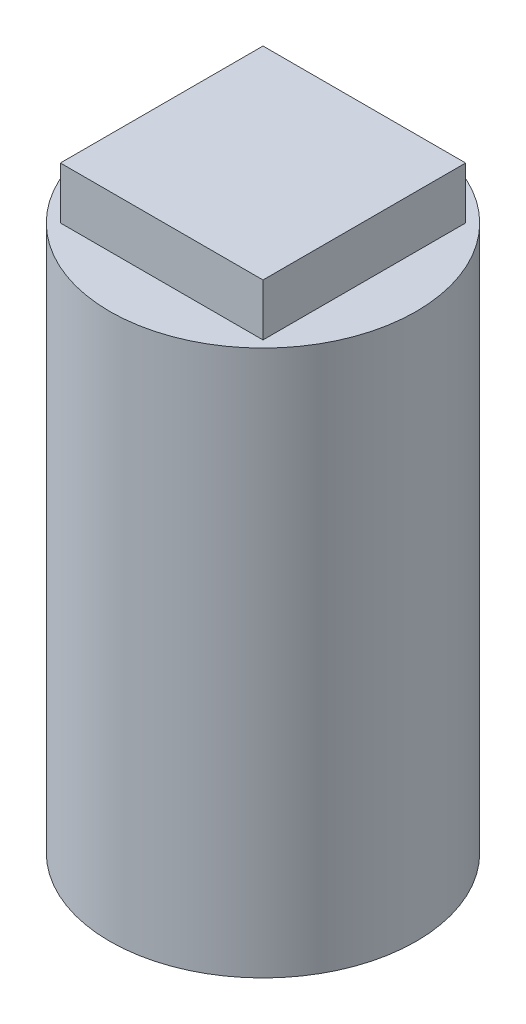
ISO-10303-21;
HEADER;
FILE_DESCRIPTION(('STEP AP214'),'2;1');
FILE_NAME('part.step','',(''),(''),'','','');
FILE_SCHEMA(('AUTOMOTIVE_DESIGN { 1 0 10303 214 1 1 1 1 }'));
ENDSEC;
DATA;
#1=APPLICATION_CONTEXT('core data for automotive mechanical design processes');
#2=APPLICATION_PROTOCOL_DEFINITION('international standard','automotive_design',2000,#1);
#3=PRODUCT_CONTEXT('',#1,'mechanical');
#4=PRODUCT('Part','Part','',(#3));
#5=PRODUCT_RELATED_PRODUCT_CATEGORY('part','',(#4));
#6=PRODUCT_DEFINITION_FORMATION('','',#4);
#7=PRODUCT_DEFINITION_CONTEXT('part definition',#1,'design');
#8=PRODUCT_DEFINITION('design','',#6,#7);
#9=PRODUCT_DEFINITION_SHAPE('','',#8);
#10=(LENGTH_UNIT() NAMED_UNIT(*) SI_UNIT(.MILLI.,.METRE.));
#11=(NAMED_UNIT(*) PLANE_ANGLE_UNIT() SI_UNIT($,.RADIAN.));
#12=(NAMED_UNIT(*) SI_UNIT($,.STERADIAN.) SOLID_ANGLE_UNIT());
#13=UNCERTAINTY_MEASURE_WITH_UNIT(LENGTH_MEASURE(1.E-05),#10,'distance_accuracy_value','');
#14=(GEOMETRIC_REPRESENTATION_CONTEXT(3) GLOBAL_UNCERTAINTY_ASSIGNED_CONTEXT((#13)) GLOBAL_UNIT_ASSIGNED_CONTEXT((#10,
#11,#12)) REPRESENTATION_CONTEXT('',''));
#15=CARTESIAN_POINT('',(0.,0.,0.));
#16=DIRECTION('',(0.,0.,1.));
#17=DIRECTION('',(1.,0.,0.));
#18=AXIS2_PLACEMENT_3D('',#15,#16,#17);
#19=CARTESIAN_POINT('',(0.,10.5,0.));
#20=DIRECTION('',(0.,-1.,0.));
#21=DIRECTION('',(0.,0.,-1.));
#22=AXIS2_PLACEMENT_3D('',#19,#20,#21);
#23=CYLINDRICAL_SURFACE('',#22,2.95);
#24=CARTESIAN_POINT('',(0.,10.5,0.));
#25=DIRECTION('',(0.,1.,0.));
#26=DIRECTION('',(0.,0.,1.));
#27=AXIS2_PLACEMENT_3D('',#24,#25,#26);
#28=CIRCLE('',#27,2.95);
#29=CARTESIAN_POINT('',(0.,10.5,-2.95));
#30=VERTEX_POINT('',#29);
#31=EDGE_CURVE('E11',#30,#30,#28,.T.);
#32=CARTESIAN_POINT('',(0.,0.,0.));
#33=DIRECTION('',(0.,1.,0.));
#34=DIRECTION('',(0.,0.,1.));
#35=AXIS2_PLACEMENT_3D('',#32,#33,#34);
#36=CIRCLE('',#35,2.95);
#37=CARTESIAN_POINT('',(0.,0.,-2.95));
#38=VERTEX_POINT('',#37);
#39=EDGE_CURVE('E42',#38,#38,#36,.T.);
#40=CARTESIAN_POINT('',(0.,10.5,-2.95));
#41=CARTESIAN_POINT('',(0.,10.390625,-2.95));
#42=CARTESIAN_POINT('',(0.,10.28125,-2.95));
#43=CARTESIAN_POINT('',(0.,10.0625,-2.95));
#44=CARTESIAN_POINT('',(0.,9.953125,-2.95));
#45=CARTESIAN_POINT('',(0.,9.734375,-2.95));
#46=CARTESIAN_POINT('',(0.,9.625,-2.95));
#47=CARTESIAN_POINT('',(0.,9.40625,-2.95));
#48=CARTESIAN_POINT('',(0.,9.296875,-2.95));
#49=CARTESIAN_POINT('',(0.,9.078125,-2.95));
#50=CARTESIAN_POINT('',(0.,8.96875,-2.95));
#51=CARTESIAN_POINT('',(0.,8.75,-2.95));
#52=CARTESIAN_POINT('',(0.,8.640625,-2.95));
#53=CARTESIAN_POINT('',(0.,8.421875,-2.95));
#54=CARTESIAN_POINT('',(0.,8.3125,-2.95));
#55=CARTESIAN_POINT('',(0.,8.09375,-2.95));
#56=CARTESIAN_POINT('',(0.,7.984375,-2.95));
#57=CARTESIAN_POINT('',(0.,7.765625,-2.95));
#58=CARTESIAN_POINT('',(0.,7.65625,-2.95));
#59=CARTESIAN_POINT('',(0.,7.4375,-2.95));
#60=CARTESIAN_POINT('',(0.,7.328125,-2.95));
#61=CARTESIAN_POINT('',(0.,7.109375,-2.95));
#62=CARTESIAN_POINT('',(0.,7.,-2.95));
#63=CARTESIAN_POINT('',(0.,6.78125,-2.95));
#64=CARTESIAN_POINT('',(0.,6.671875,-2.95));
#65=CARTESIAN_POINT('',(0.,6.453125,-2.95));
#66=CARTESIAN_POINT('',(0.,6.34375,-2.95));
#67=CARTESIAN_POINT('',(0.,6.125,-2.95));
#68=CARTESIAN_POINT('',(0.,6.015625,-2.95));
#69=CARTESIAN_POINT('',(0.,5.796875,-2.95));
#70=CARTESIAN_POINT('',(0.,5.6875,-2.95));
#71=CARTESIAN_POINT('',(0.,5.46875,-2.95));
#72=CARTESIAN_POINT('',(0.,5.359375,-2.95));
#73=CARTESIAN_POINT('',(0.,5.140625,-2.95));
#74=CARTESIAN_POINT('',(0.,5.03125,-2.95));
#75=CARTESIAN_POINT('',(0.,4.8125,-2.95));
#76=CARTESIAN_POINT('',(0.,4.703125,-2.95));
#77=CARTESIAN_POINT('',(0.,4.484375,-2.95));
#78=CARTESIAN_POINT('',(0.,4.375,-2.95));
#79=CARTESIAN_POINT('',(0.,4.15625,-2.95));
#80=CARTESIAN_POINT('',(0.,4.046875,-2.95));
#81=CARTESIAN_POINT('',(0.,3.828125,-2.95));
#82=CARTESIAN_POINT('',(0.,3.71875,-2.95));
#83=CARTESIAN_POINT('',(0.,3.5,-2.95));
#84=CARTESIAN_POINT('',(0.,3.390625,-2.95));
#85=CARTESIAN_POINT('',(0.,3.171875,-2.95));
#86=CARTESIAN_POINT('',(0.,3.0625,-2.95));
#87=CARTESIAN_POINT('',(0.,2.84375,-2.95));
#88=CARTESIAN_POINT('',(0.,2.734375,-2.95));
#89=CARTESIAN_POINT('',(0.,2.515625,-2.95));
#90=CARTESIAN_POINT('',(0.,2.40625,-2.95));
#91=CARTESIAN_POINT('',(0.,2.1875,-2.95));
#92=CARTESIAN_POINT('',(0.,2.078125,-2.95));
#93=CARTESIAN_POINT('',(0.,1.859375,-2.95));
#94=CARTESIAN_POINT('',(0.,1.75,-2.95));
#95=CARTESIAN_POINT('',(0.,1.53125,-2.95));
#96=CARTESIAN_POINT('',(0.,1.421875,-2.95));
#97=CARTESIAN_POINT('',(0.,1.203125,-2.95));
#98=CARTESIAN_POINT('',(0.,1.09375,-2.95));
#99=CARTESIAN_POINT('',(0.,0.875000000000001,-2.95));
#100=CARTESIAN_POINT('',(0.,0.765625000000001,-2.95));
#101=CARTESIAN_POINT('',(0.,0.546875,-2.95));
#102=CARTESIAN_POINT('',(0.,0.4375,-2.95));
#103=CARTESIAN_POINT('',(0.,0.21875,-2.95));
#104=CARTESIAN_POINT('',(0.,0.109375,-2.95));
#105=CARTESIAN_POINT('',(0.,0.,-2.95));
#106=B_SPLINE_CURVE_WITH_KNOTS('',3,(#40,#41,#42,#43,#44,#45,#46,#47,#48,#49,#50,#51,#52,#53,
#54,#55,#56,#57,#58,#59,#60,#61,#62,#63,#64,#65,#66,#67,#68,#69,#70,#71,#72,#73,#74,#75,#76,#77,
#78,#79,#80,#81,#82,#83,#84,#85,#86,#87,#88,#89,#90,#91,#92,#93,#94,#95,#96,#97,#98,#99,#100,
#101,#102,#103,#104,#105),.UNSPECIFIED.,.F.,.F.,(4,2,2,2,2,2,2,2,2,2,2,2,2,2,2,2,2,2,2,2,2,2,2,
2,2,2,2,2,2,2,2,2,4),(0.,0.328125,0.656250000000001,0.984375000000001,1.3125,1.640625,1.96875,
2.296875,2.625,2.953125,3.28125,3.609375,3.9375,4.265625,4.59375,4.921875,5.25,5.578125,5.90625,
6.234375,6.5625,6.890625,7.21875,7.546875,7.875,8.203125,8.53125,8.859375,9.1875,9.515625,
9.84375,10.171875,10.5),.UNSPECIFIED.);
#107=EDGE_CURVE('BSEAM39',#30,#38,#106,.T.);
#108=ORIENTED_EDGE('',*,*,#31,.F.);
#109=ORIENTED_EDGE('',*,*,#39,.T.);
#110=ORIENTED_EDGE('',*,*,#107,.T.);
#111=ORIENTED_EDGE('',*,*,#107,.F.);
#112=EDGE_LOOP('',(#108,#110,#109,#111));
#113=FACE_BOUND('',#112,.T.);
#114=ADVANCED_FACE('F39',(#113),#23,.T.);
#115=CARTESIAN_POINT('',(0.,10.5,0.));
#116=DIRECTION('',(0.,1.,0.));
#117=DIRECTION('',(0.,0.,1.));
#118=AXIS2_PLACEMENT_3D('',#115,#116,#117);
#119=PLANE('',#118);
#120=DIRECTION('',(0.,0.,1.));
#121=VECTOR('',#120,1.);
#122=CARTESIAN_POINT('',(-1.95,10.5,-1.95));
#123=LINE('',#122,#121);
#124=CARTESIAN_POINT('',(-1.95,10.5,-1.95));
#125=VERTEX_POINT('',#124);
#126=CARTESIAN_POINT('',(-1.95,10.5,1.95));
#127=VERTEX_POINT('',#126);
#128=EDGE_CURVE('E54',#125,#127,#123,.T.);
#129=ORIENTED_EDGE('',*,*,#128,.F.);
#130=DIRECTION('',(-1.,0.,0.));
#131=VECTOR('',#130,1.);
#132=CARTESIAN_POINT('',(1.95,10.5,-1.95));
#133=LINE('',#132,#131);
#134=CARTESIAN_POINT('',(1.95,10.5,-1.95));
#135=VERTEX_POINT('',#134);
#136=EDGE_CURVE('E58',#135,#125,#133,.T.);
#137=ORIENTED_EDGE('',*,*,#136,.F.);
#138=DIRECTION('',(0.,0.,-1.));
#139=VECTOR('',#138,1.);
#140=CARTESIAN_POINT('',(1.95,10.5,-1.95));
#141=LINE('',#140,#139);
#142=CARTESIAN_POINT('',(1.95,10.5,1.95));
#143=VERTEX_POINT('',#142);
#144=EDGE_CURVE('E118',#143,#135,#141,.T.);
#145=ORIENTED_EDGE('',*,*,#144,.F.);
#146=DIRECTION('',(1.,0.,0.));
#147=VECTOR('',#146,1.);
#148=CARTESIAN_POINT('',(1.95,10.5,1.95));
#149=LINE('',#148,#147);
#150=EDGE_CURVE('E121',#127,#143,#149,.T.);
#151=ORIENTED_EDGE('',*,*,#150,.F.);
#152=EDGE_LOOP('',(#129,#137,#145,#151));
#153=FACE_BOUND('',#152,.T.);
#154=ORIENTED_EDGE('',*,*,#31,.T.);
#155=EDGE_LOOP('',(#154));
#156=FACE_BOUND('',#155,.T.);
#157=ADVANCED_FACE('F143',(#153,#156),#119,.T.);
#158=CARTESIAN_POINT('',(0.,0.,0.));
#159=DIRECTION('',(0.,1.,0.));
#160=DIRECTION('',(0.,0.,1.));
#161=AXIS2_PLACEMENT_3D('',#158,#159,#160);
#162=PLANE('',#161);
#163=ORIENTED_EDGE('',*,*,#39,.F.);
#164=EDGE_LOOP('',(#163));
#165=FACE_BOUND('',#164,.T.);
#166=ADVANCED_FACE('F148',(#165),#162,.F.);
#167=CARTESIAN_POINT('',(-1.95,11.5,-1.95));
#168=DIRECTION('',(1.,0.,0.));
#169=DIRECTION('',(0.,0.,-1.));
#170=AXIS2_PLACEMENT_3D('',#167,#168,#169);
#171=PLANE('',#170);
#172=ORIENTED_EDGE('',*,*,#128,.T.);
#173=DIRECTION('',(0.,-1.,0.));
#174=VECTOR('',#173,1.);
#175=CARTESIAN_POINT('',(-1.95,11.5,1.95));
#176=LINE('',#175,#174);
#177=CARTESIAN_POINT('',(-1.95,11.5,1.95));
#178=VERTEX_POINT('',#177);
#179=EDGE_CURVE('E83',#178,#127,#176,.T.);
#180=ORIENTED_EDGE('',*,*,#179,.F.);
#181=DIRECTION('',(0.,0.,1.));
#182=VECTOR('',#181,1.);
#183=CARTESIAN_POINT('',(-1.95,11.5,-1.95));
#184=LINE('',#183,#182);
#185=CARTESIAN_POINT('',(-1.95,11.5,-1.95));
#186=VERTEX_POINT('',#185);
#187=EDGE_CURVE('E90',#186,#178,#184,.T.);
#188=ORIENTED_EDGE('',*,*,#187,.F.);
#189=DIRECTION('',(0.,-1.,0.));
#190=VECTOR('',#189,1.);
#191=CARTESIAN_POINT('',(-1.95,11.5,-1.95));
#192=LINE('',#191,#190);
#193=EDGE_CURVE('E113',#186,#125,#192,.T.);
#194=ORIENTED_EDGE('',*,*,#193,.T.);
#195=EDGE_LOOP('',(#172,#180,#188,#194));
#196=FACE_BOUND('',#195,.T.);
#197=ADVANCED_FACE('F101',(#196),#171,.F.);
#198=CARTESIAN_POINT('',(1.95,11.5,1.95));
#199=DIRECTION('',(0.,0.,-1.));
#200=DIRECTION('',(-1.,0.,0.));
#201=AXIS2_PLACEMENT_3D('',#198,#199,#200);
#202=PLANE('',#201);
#203=ORIENTED_EDGE('',*,*,#150,.T.);
#204=DIRECTION('',(0.,-1.,0.));
#205=VECTOR('',#204,1.);
#206=CARTESIAN_POINT('',(1.95,11.5,1.95));
#207=LINE('',#206,#205);
#208=CARTESIAN_POINT('',(1.95,11.5,1.95));
#209=VERTEX_POINT('',#208);
#210=EDGE_CURVE('E85',#209,#143,#207,.T.);
#211=ORIENTED_EDGE('',*,*,#210,.F.);
#212=DIRECTION('',(1.,0.,0.));
#213=VECTOR('',#212,1.);
#214=CARTESIAN_POINT('',(1.95,11.5,1.95));
#215=LINE('',#214,#213);
#216=EDGE_CURVE('E78',#178,#209,#215,.T.);
#217=ORIENTED_EDGE('',*,*,#216,.F.);
#218=ORIENTED_EDGE('',*,*,#179,.T.);
#219=EDGE_LOOP('',(#203,#211,#217,#218));
#220=FACE_BOUND('',#219,.T.);
#221=ADVANCED_FACE('F81',(#220),#202,.F.);
#222=CARTESIAN_POINT('',(1.95,11.5,-1.95));
#223=DIRECTION('',(-1.,0.,0.));
#224=DIRECTION('',(0.,0.,1.));
#225=AXIS2_PLACEMENT_3D('',#222,#223,#224);
#226=PLANE('',#225);
#227=ORIENTED_EDGE('',*,*,#144,.T.);
#228=DIRECTION('',(0.,-1.,0.));
#229=VECTOR('',#228,1.);
#230=CARTESIAN_POINT('',(1.95,11.5,-1.95));
#231=LINE('',#230,#229);
#232=CARTESIAN_POINT('',(1.95,11.5,-1.95));
#233=VERTEX_POINT('',#232);
#234=EDGE_CURVE('E107',#233,#135,#231,.T.);
#235=ORIENTED_EDGE('',*,*,#234,.F.);
#236=DIRECTION('',(0.,0.,-1.));
#237=VECTOR('',#236,1.);
#238=CARTESIAN_POINT('',(1.95,11.5,-1.95));
#239=LINE('',#238,#237);
#240=EDGE_CURVE('E89',#209,#233,#239,.T.);
#241=ORIENTED_EDGE('',*,*,#240,.F.);
#242=ORIENTED_EDGE('',*,*,#210,.T.);
#243=EDGE_LOOP('',(#227,#235,#241,#242));
#244=FACE_BOUND('',#243,.T.);
#245=ADVANCED_FACE('F131',(#244),#226,.F.);
#246=CARTESIAN_POINT('',(1.95,11.5,-1.95));
#247=DIRECTION('',(0.,0.,1.));
#248=DIRECTION('',(1.,0.,0.));
#249=AXIS2_PLACEMENT_3D('',#246,#247,#248);
#250=PLANE('',#249);
#251=ORIENTED_EDGE('',*,*,#136,.T.);
#252=ORIENTED_EDGE('',*,*,#193,.F.);
#253=DIRECTION('',(-1.,0.,0.));
#254=VECTOR('',#253,1.);
#255=CARTESIAN_POINT('',(1.95,11.5,-1.95));
#256=LINE('',#255,#254);
#257=EDGE_CURVE('E95',#233,#186,#256,.T.);
#258=ORIENTED_EDGE('',*,*,#257,.F.);
#259=ORIENTED_EDGE('',*,*,#234,.T.);
#260=EDGE_LOOP('',(#251,#252,#258,#259));
#261=FACE_BOUND('',#260,.T.);
#262=ADVANCED_FACE('F133',(#261),#250,.F.);
#263=CARTESIAN_POINT('',(0.,11.5,0.));
#264=DIRECTION('',(0.,-1.,0.));
#265=DIRECTION('',(0.,0.,-1.));
#266=AXIS2_PLACEMENT_3D('',#263,#264,#265);
#267=PLANE('',#266);
#268=ORIENTED_EDGE('',*,*,#187,.T.);
#269=ORIENTED_EDGE('',*,*,#216,.T.);
#270=ORIENTED_EDGE('',*,*,#240,.T.);
#271=ORIENTED_EDGE('',*,*,#257,.T.);
#272=EDGE_LOOP('',(#268,#269,#270,#271));
#273=FACE_BOUND('',#272,.T.);
#274=ADVANCED_FACE('F93',(#273),#267,.F.);
#275=CLOSED_SHELL('',(#114,#157,#166,#197,#221,#245,#262,#274));
#276=MANIFOLD_SOLID_BREP('B2',#275);
#277=ADVANCED_BREP_SHAPE_REPRESENTATION('',(#18,#276),#14);
#278=SHAPE_DEFINITION_REPRESENTATION(#9,#277);
ENDSEC;
END-ISO-10303-21;
